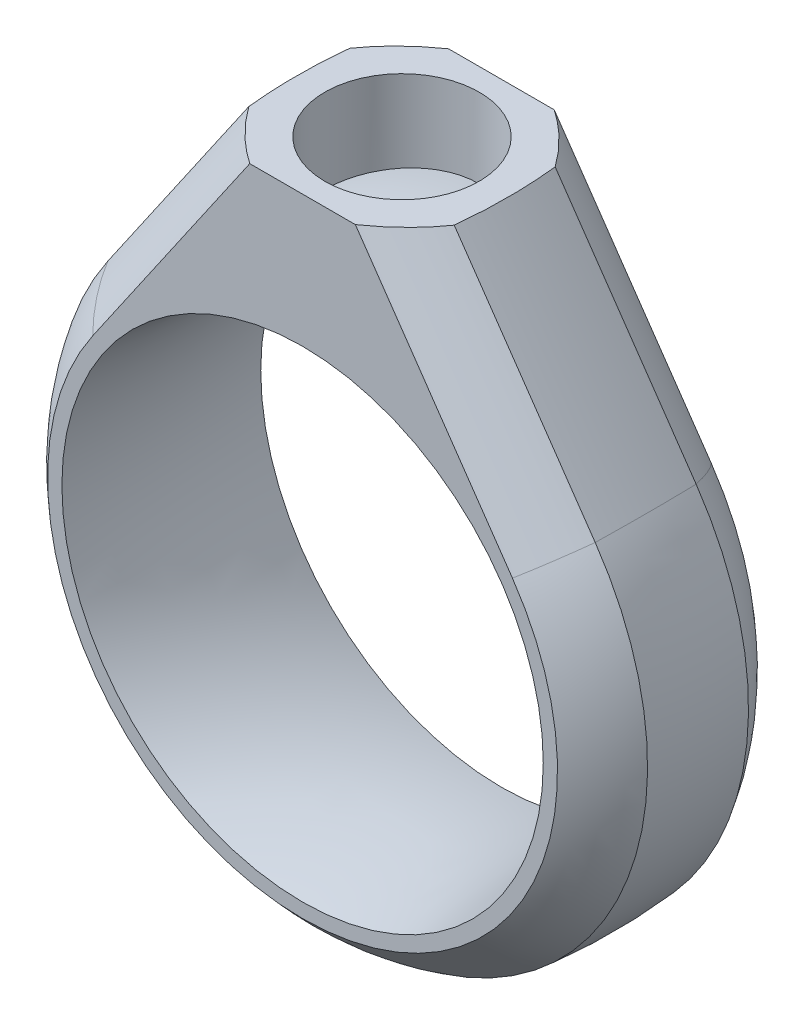
ISO-10303-21;
HEADER;
FILE_DESCRIPTION(('STEP AP214'),'2;1');
FILE_NAME('part.step','',(''),(''),'','','');
FILE_SCHEMA(('AUTOMOTIVE_DESIGN { 1 0 10303 214 1 1 1 1 }'));
ENDSEC;
DATA;
#1=APPLICATION_CONTEXT('core data for automotive mechanical design processes');
#2=APPLICATION_PROTOCOL_DEFINITION('international standard','automotive_design',2000,#1);
#3=PRODUCT_CONTEXT('',#1,'mechanical');
#4=PRODUCT('Part','Part','',(#3));
#5=PRODUCT_RELATED_PRODUCT_CATEGORY('part','',(#4));
#6=PRODUCT_DEFINITION_FORMATION('','',#4);
#7=PRODUCT_DEFINITION_CONTEXT('part definition',#1,'design');
#8=PRODUCT_DEFINITION('design','',#6,#7);
#9=PRODUCT_DEFINITION_SHAPE('','',#8);
#10=(LENGTH_UNIT() NAMED_UNIT(*) SI_UNIT(.MILLI.,.METRE.));
#11=(NAMED_UNIT(*) PLANE_ANGLE_UNIT() SI_UNIT($,.RADIAN.));
#12=(NAMED_UNIT(*) SI_UNIT($,.STERADIAN.) SOLID_ANGLE_UNIT());
#13=UNCERTAINTY_MEASURE_WITH_UNIT(LENGTH_MEASURE(1.E-05),#10,'distance_accuracy_value','');
#14=(GEOMETRIC_REPRESENTATION_CONTEXT(3) GLOBAL_UNCERTAINTY_ASSIGNED_CONTEXT((#13)) GLOBAL_UNIT_ASSIGNED_CONTEXT((#10,
#11,#12)) REPRESENTATION_CONTEXT('',''));
#15=CARTESIAN_POINT('',(0.,0.,0.));
#16=DIRECTION('',(0.,0.,1.));
#17=DIRECTION('',(1.,0.,0.));
#18=AXIS2_PLACEMENT_3D('',#15,#16,#17);
#19=CARTESIAN_POINT('',(0.,-11.43,1.59200093369737));
#20=DIRECTION('',(0.,0.,1.));
#21=DIRECTION('',(1.,0.,0.));
#22=AXIS2_PLACEMENT_3D('',#19,#20,#21);
#23=DEGENERATE_TOROIDAL_SURFACE('',#22,5.23755739491984,7.05181139582833,.T.);
#24=CARTESIAN_POINT('',(4.31107537380725,-8.4556703971429,1.59200093369736));
#25=DIRECTION('',(0.567884870482195,-0.823107996484921,0.));
#26=DIRECTION('',(0.823107996484921,0.567884870482195,0.));
#27=AXIS2_PLACEMENT_3D('',#24,#25,#26);
#28=CIRCLE('',#27,7.05181139582833);
#29=CARTESIAN_POINT('',(8.04207328577188,-5.88155220724121,-3.81));
#30=VERTEX_POINT('',#29);
#31=CARTESIAN_POINT('',(9.33783526235542,-4.98757034168976,-1.93390476421679));
#32=VERTEX_POINT('',#31);
#33=EDGE_CURVE('E386',#30,#32,#28,.T.);
#34=ORIENTED_EDGE('',*,*,#33,.T.);
#35=CARTESIAN_POINT('',(0.,-11.43,-1.93390476421679));
#36=DIRECTION('',(0.,0.,1.));
#37=DIRECTION('',(1.,0.,0.));
#38=AXIS2_PLACEMENT_3D('',#35,#36,#37);
#39=CIRCLE('',#38,11.3446052064038);
#40=CARTESIAN_POINT('',(-9.33783526235542,-4.98757034168976,-1.93390476421679));
#41=VERTEX_POINT('',#40);
#42=EDGE_CURVE('E53',#41,#32,#39,.T.);
#43=ORIENTED_EDGE('',*,*,#42,.F.);
#44=CARTESIAN_POINT('',(-4.3110753738073,-8.45567039714285,1.59200093369733));
#45=DIRECTION('',(0.567884870482195,0.823107996484921,0.));
#46=DIRECTION('',(-0.823107996484921,0.567884870482195,0.));
#47=AXIS2_PLACEMENT_3D('',#44,#45,#46);
#48=CIRCLE('',#47,7.05181139582826);
#49=CARTESIAN_POINT('',(-8.04207328577188,-5.88155220724121,-3.81));
#50=VERTEX_POINT('',#49);
#51=EDGE_CURVE('E385',#50,#41,#48,.T.);
#52=ORIENTED_EDGE('',*,*,#51,.F.);
#53=CARTESIAN_POINT('',(0.,-11.43,-3.81));
#54=DIRECTION('',(0.,0.,1.));
#55=DIRECTION('',(1.,0.,0.));
#56=AXIS2_PLACEMENT_3D('',#53,#54,#55);
#57=CIRCLE('',#56,9.77037438600464);
#58=EDGE_CURVE('E153',#30,#50,#57,.F.);
#59=ORIENTED_EDGE('',*,*,#58,.F.);
#60=EDGE_LOOP('',(#34,#43,#52,#59));
#61=FACE_BOUND('',#60,.T.);
#62=ADVANCED_FACE('F45',(#61),#23,.T.);
#63=CARTESIAN_POINT('',(0.,-11.43,-1.59200093369734));
#64=DIRECTION('',(0.,0.,1.));
#65=DIRECTION('',(1.,0.,0.));
#66=AXIS2_PLACEMENT_3D('',#63,#64,#65);
#67=DEGENERATE_TOROIDAL_SURFACE('',#66,5.23755739491988,7.05181139582828,.T.);
#68=CARTESIAN_POINT('',(4.31107537380724,-8.4556703971429,-1.59200093369738));
#69=DIRECTION('',(0.567884870482195,-0.823107996484921,0.));
#70=DIRECTION('',(0.823107996484921,0.567884870482195,0.));
#71=AXIS2_PLACEMENT_3D('',#68,#69,#70);
#72=CIRCLE('',#71,7.05181139582834);
#73=CARTESIAN_POINT('',(9.33783526235542,-4.98757034168976,1.93390476421677));
#74=VERTEX_POINT('',#73);
#75=CARTESIAN_POINT('',(8.04207328577187,-5.88155220724121,3.81));
#76=VERTEX_POINT('',#75);
#77=EDGE_CURVE('E111',#74,#76,#72,.T.);
#78=ORIENTED_EDGE('',*,*,#77,.T.);
#79=CARTESIAN_POINT('',(0.,-11.43,3.81));
#80=DIRECTION('',(0.,0.,1.));
#81=DIRECTION('',(1.,0.,0.));
#82=AXIS2_PLACEMENT_3D('',#79,#80,#81);
#83=CIRCLE('',#82,9.77037438600463);
#84=CARTESIAN_POINT('',(-8.04207328577187,-5.8815522072412,3.81000000000001));
#85=VERTEX_POINT('',#84);
#86=EDGE_CURVE('E396',#85,#76,#83,.T.);
#87=ORIENTED_EDGE('',*,*,#86,.F.);
#88=CARTESIAN_POINT('',(-4.31107537380721,-8.45567039714292,-1.59200093369738));
#89=DIRECTION('',(0.567884870482195,0.823107996484921,0.));
#90=DIRECTION('',(-0.823107996484921,0.567884870482195,0.));
#91=AXIS2_PLACEMENT_3D('',#88,#89,#90);
#92=CIRCLE('',#91,7.05181139582838);
#93=CARTESIAN_POINT('',(-9.33783526235542,-4.98757034168975,1.93390476421677));
#94=VERTEX_POINT('',#93);
#95=EDGE_CURVE('E142',#94,#85,#92,.T.);
#96=ORIENTED_EDGE('',*,*,#95,.F.);
#97=CARTESIAN_POINT('',(0.,-11.43,1.93390476421677));
#98=DIRECTION('',(0.,0.,-1.));
#99=DIRECTION('',(-1.,0.,0.));
#100=AXIS2_PLACEMENT_3D('',#97,#98,#99);
#101=CIRCLE('',#100,11.3446052064038);
#102=EDGE_CURVE('E132',#74,#94,#101,.T.);
#103=ORIENTED_EDGE('',*,*,#102,.F.);
#104=EDGE_LOOP('',(#78,#87,#96,#103));
#105=FACE_BOUND('',#104,.T.);
#106=ADVANCED_FACE('F141',(#105),#67,.T.);
#107=CARTESIAN_POINT('',(0.,-11.43,0.));
#108=DIRECTION('',(0.,0.,1.));
#109=DIRECTION('',(1.,0.,0.));
#110=AXIS2_PLACEMENT_3D('',#107,#108,#109);
#111=DEGENERATE_TOROIDAL_SURFACE('',#110,10.5109155407772,21.9409155407772,.F.);
#112=CARTESIAN_POINT('',(8.65161863199134,-17.3989899105235,0.));
#113=DIRECTION('',(0.567884870482195,0.823107996484921,0.));
#114=DIRECTION('',(-0.823107996484921,0.567884870482195,0.));
#115=AXIS2_PLACEMENT_3D('',#112,#113,#114);
#116=CIRCLE('',#115,21.9409155407772);
#117=EDGE_CURVE('E171',#94,#41,#116,.F.);
#118=ORIENTED_EDGE('',*,*,#117,.T.);
#119=ORIENTED_EDGE('',*,*,#42,.T.);
#120=CARTESIAN_POINT('',(-8.65161863199133,-17.3989899105236,0.));
#121=DIRECTION('',(0.567884870482195,-0.823107996484921,0.));
#122=DIRECTION('',(0.823107996484921,0.567884870482195,0.));
#123=AXIS2_PLACEMENT_3D('',#120,#121,#122);
#124=CIRCLE('',#123,21.9409155407772);
#125=EDGE_CURVE('E129',#32,#74,#124,.T.);
#126=ORIENTED_EDGE('',*,*,#125,.T.);
#127=ORIENTED_EDGE('',*,*,#102,.T.);
#128=EDGE_LOOP('',(#118,#119,#126,#127));
#129=FACE_BOUND('',#128,.T.);
#130=ADVANCED_FACE('F131',(#129),#111,.F.);
#131=CARTESIAN_POINT('',(0.,-11.43,-3.81));
#132=DIRECTION('',(0.,0.,1.));
#133=DIRECTION('',(1.,0.,0.));
#134=AXIS2_PLACEMENT_3D('',#131,#132,#133);
#135=PLANE('',#134);
#136=ORIENTED_EDGE('',*,*,#58,.T.);
#137=DIRECTION('',(0.567884870482194,0.823107996484921,0.));
#138=VECTOR('',#137,1.);
#139=CARTESIAN_POINT('',(-2.54332447316267,2.0884860057464,-3.81));
#140=LINE('',#139,#138);
#141=CARTESIAN_POINT('',(-2.023683344541,2.84166819196623,-3.81));
#142=VERTEX_POINT('',#141);
#143=EDGE_CURVE('E156',#50,#142,#140,.T.);
#144=ORIENTED_EDGE('',*,*,#143,.T.);
#145=DIRECTION('',(-1.,0.,0.));
#146=VECTOR('',#145,1.);
#147=CARTESIAN_POINT('',(0.,2.84166819196623,-3.81));
#148=LINE('',#147,#146);
#149=CARTESIAN_POINT('',(2.02368334454099,2.84166819196623,-3.81));
#150=VERTEX_POINT('',#149);
#151=EDGE_CURVE('E161',#150,#142,#148,.T.);
#152=ORIENTED_EDGE('',*,*,#151,.F.);
#153=DIRECTION('',(0.567884870482195,-0.823107996484921,0.));
#154=VECTOR('',#153,1.);
#155=CARTESIAN_POINT('',(8.04207328577187,-5.8815522072412,-3.81));
#156=LINE('',#155,#154);
#157=EDGE_CURVE('E150',#150,#30,#156,.T.);
#158=ORIENTED_EDGE('',*,*,#157,.T.);
#159=EDGE_LOOP('',(#136,#144,#152,#158));
#160=FACE_BOUND('',#159,.T.);
#161=CARTESIAN_POINT('',(0.,-11.43,-3.81000000000001));
#162=DIRECTION('',(0.,0.,-1.));
#163=DIRECTION('',(-1.,0.,0.));
#164=AXIS2_PLACEMENT_3D('',#161,#162,#163);
#165=CIRCLE('',#164,9.22333180803377);
#166=CARTESIAN_POINT('',(-9.22333180803377,-11.43,-3.81000000000001));
#167=VERTEX_POINT('',#166);
#168=EDGE_CURVE('E177',#167,#167,#165,.T.);
#169=ORIENTED_EDGE('',*,*,#168,.F.);
#170=EDGE_LOOP('',(#169));
#171=FACE_BOUND('',#170,.T.);
#172=ADVANCED_FACE('F47',(#160,#171),#135,.F.);
#173=CARTESIAN_POINT('',(0.,-11.43,3.81));
#174=DIRECTION('',(0.,0.,1.));
#175=DIRECTION('',(1.,0.,0.));
#176=AXIS2_PLACEMENT_3D('',#173,#174,#175);
#177=PLANE('',#176);
#178=ORIENTED_EDGE('',*,*,#86,.T.);
#179=DIRECTION('',(-0.567884870482195,0.823107996484921,0.));
#180=VECTOR('',#179,1.);
#181=CARTESIAN_POINT('',(2.54332447316265,2.08848600574639,3.81));
#182=LINE('',#181,#180);
#183=CARTESIAN_POINT('',(2.02368334454097,2.84166819196623,3.81));
#184=VERTEX_POINT('',#183);
#185=EDGE_CURVE('E118',#76,#184,#182,.T.);
#186=ORIENTED_EDGE('',*,*,#185,.T.);
#187=DIRECTION('',(1.,0.,0.));
#188=VECTOR('',#187,1.);
#189=CARTESIAN_POINT('',(-3.81,2.84166819196623,3.81));
#190=LINE('',#189,#188);
#191=CARTESIAN_POINT('',(-2.02368334454099,2.84166819196623,3.81));
#192=VERTEX_POINT('',#191);
#193=EDGE_CURVE('E172',#184,#192,#190,.F.);
#194=ORIENTED_EDGE('',*,*,#193,.T.);
#195=DIRECTION('',(-0.567884870482195,-0.823107996484921,0.));
#196=VECTOR('',#195,1.);
#197=CARTESIAN_POINT('',(-8.04207328577187,-5.8815522072412,3.81));
#198=LINE('',#197,#196);
#199=EDGE_CURVE('E174',#192,#85,#198,.T.);
#200=ORIENTED_EDGE('',*,*,#199,.T.);
#201=EDGE_LOOP('',(#178,#186,#194,#200));
#202=FACE_BOUND('',#201,.T.);
#203=CARTESIAN_POINT('',(0.,-11.43,3.81000000000001));
#204=DIRECTION('',(0.,0.,1.));
#205=DIRECTION('',(1.,0.,0.));
#206=AXIS2_PLACEMENT_3D('',#203,#204,#205);
#207=CIRCLE('',#206,9.22333180803377);
#208=CARTESIAN_POINT('',(9.22333180803377,-11.43,3.81000000000001));
#209=VERTEX_POINT('',#208);
#210=EDGE_CURVE('E191',#209,#209,#207,.T.);
#211=ORIENTED_EDGE('',*,*,#210,.F.);
#212=EDGE_LOOP('',(#211));
#213=FACE_BOUND('',#212,.T.);
#214=ADVANCED_FACE('F207',(#202,#213),#177,.T.);
#215=CARTESIAN_POINT('',(0.,2.84166819196623,0.));
#216=DIRECTION('',(0.,1.,0.));
#217=DIRECTION('',(0.,0.,1.));
#218=AXIS2_PLACEMENT_3D('',#215,#216,#217);
#219=PLANE('',#218);
#220=ORIENTED_EDGE('',*,*,#151,.T.);
#221=CARTESIAN_POINT('',(3.48326958319402,2.84166819196623,1.59200093369732));
#222=DIRECTION('',(0.,1.,0.));
#223=DIRECTION('',(-1.,0.,0.));
#224=AXIS2_PLACEMENT_3D('',#221,#222,#223);
#225=ELLIPSE('',#224,8.56729788307609,7.05181139582826);
#226=CARTESIAN_POINT('',(-3.93622802533852,2.84166819196623,-1.9339047642168));
#227=VERTEX_POINT('',#226);
#228=EDGE_CURVE('E169',#142,#227,#225,.T.);
#229=ORIENTED_EDGE('',*,*,#228,.T.);
#230=CARTESIAN_POINT('',(22.616205969368,2.84166819196623,0.));
#231=DIRECTION('',(0.,1.,0.));
#232=DIRECTION('',(-1.,0.,0.));
#233=AXIS2_PLACEMENT_3D('',#230,#231,#232);
#234=ELLIPSE('',#233,26.6561807617905,21.9409155407773);
#235=CARTESIAN_POINT('',(-3.93622802533853,2.84166819196623,1.93390476421676));
#236=VERTEX_POINT('',#235);
#237=EDGE_CURVE('E136',#227,#236,#234,.T.);
#238=ORIENTED_EDGE('',*,*,#237,.T.);
#239=CARTESIAN_POINT('',(3.48326958319416,2.84166819196623,-1.59200093369739));
#240=DIRECTION('',(0.,1.,0.));
#241=DIRECTION('',(-1.,0.,0.));
#242=AXIS2_PLACEMENT_3D('',#239,#240,#241);
#243=ELLIPSE('',#242,8.56729788307623,7.05181139582838);
#244=EDGE_CURVE('E388',#236,#192,#243,.T.);
#245=ORIENTED_EDGE('',*,*,#244,.T.);
#246=ORIENTED_EDGE('',*,*,#193,.F.);
#247=CARTESIAN_POINT('',(-3.48326958319413,2.84166819196623,-1.59200093369738));
#248=DIRECTION('',(0.,1.,0.));
#249=DIRECTION('',(1.,0.,0.));
#250=AXIS2_PLACEMENT_3D('',#247,#248,#249);
#251=ELLIPSE('',#250,8.56729788307619,7.05181139582834);
#252=CARTESIAN_POINT('',(3.93622802533851,2.84166819196623,1.93390476421678));
#253=VERTEX_POINT('',#252);
#254=EDGE_CURVE('E123',#253,#184,#251,.F.);
#255=ORIENTED_EDGE('',*,*,#254,.F.);
#256=CARTESIAN_POINT('',(-22.616205969368,2.84166819196623,0.));
#257=DIRECTION('',(0.,1.,0.));
#258=DIRECTION('',(1.,0.,0.));
#259=AXIS2_PLACEMENT_3D('',#256,#257,#258);
#260=ELLIPSE('',#259,26.6561807617904,21.9409155407772);
#261=CARTESIAN_POINT('',(3.93622802533851,2.84166819196623,-1.93390476421679));
#262=VERTEX_POINT('',#261);
#263=EDGE_CURVE('E137',#262,#253,#260,.F.);
#264=ORIENTED_EDGE('',*,*,#263,.F.);
#265=CARTESIAN_POINT('',(-3.48326958319411,2.84166819196623,1.59200093369736));
#266=DIRECTION('',(0.,1.,0.));
#267=DIRECTION('',(1.,0.,0.));
#268=AXIS2_PLACEMENT_3D('',#265,#266,#267);
#269=ELLIPSE('',#268,8.56729788307617,7.05181139582833);
#270=EDGE_CURVE('E60',#150,#262,#269,.F.);
#271=ORIENTED_EDGE('',*,*,#270,.F.);
#272=EDGE_LOOP('',(#220,#229,#238,#245,#246,#255,#264,#271));
#273=FACE_BOUND('',#272,.T.);
#274=CARTESIAN_POINT('',(0.,2.84166819196623,0.));
#275=DIRECTION('',(0.,1.,0.));
#276=DIRECTION('',(0.,0.,1.));
#277=AXIS2_PLACEMENT_3D('',#274,#275,#276);
#278=CIRCLE('',#277,2.9591);
#279=CARTESIAN_POINT('',(0.,2.84166819196623,2.9591));
#280=VERTEX_POINT('',#279);
#281=EDGE_CURVE('E181',#280,#280,#278,.F.);
#282=ORIENTED_EDGE('',*,*,#281,.T.);
#283=EDGE_LOOP('',(#282));
#284=FACE_BOUND('',#283,.T.);
#285=ADVANCED_FACE('F166',(#273,#284),#219,.T.);
#286=CARTESIAN_POINT('',(0.,-1.27,0.));
#287=DIRECTION('',(0.,1.,0.));
#288=DIRECTION('',(0.,0.,1.));
#289=AXIS2_PLACEMENT_3D('',#286,#287,#288);
#290=CYLINDRICAL_SURFACE('',#289,2.9591);
#291=CARTESIAN_POINT('',(-2.10934564289651,-0.296423624207437,-2.0753153420135));
#292=CARTESIAN_POINT('',(-1.99288861060094,-0.28580718478686,-2.19367269173789));
#293=CARTESIAN_POINT('',(-1.86637758360398,-0.275162572565729,-2.30227929768123));
#294=CARTESIAN_POINT('',(-1.59677930277951,-0.255011402896367,-2.49684934189497));
#295=CARTESIAN_POINT('',(-1.45367525826803,-0.24550601837311,-2.58278955074604));
#296=CARTESIAN_POINT('',(-1.15497002760406,-0.228708759502768,-2.72946618635744));
#297=CARTESIAN_POINT('',(-0.999370556486257,-0.221416582040807,-2.79020606490567));
#298=CARTESIAN_POINT('',(-0.680112300774695,-0.209868217022376,-2.88468852205632));
#299=CARTESIAN_POINT('',(-0.516455567594511,-0.205611260915275,-2.91843793519779));
#300=CARTESIAN_POINT('',(-0.186587350480859,-0.200624673832578,-2.95785533714019));
#301=CARTESIAN_POINT('',(-0.0203931226636631,-0.199877188827538,-2.96366546748741));
#302=CARTESIAN_POINT('',(0.310607045654622,-0.201944995038328,-2.94741456232979));
#303=CARTESIAN_POINT('',(0.475412966505218,-0.20476033659841,-2.92535313298801));
#304=CARTESIAN_POINT('',(0.798349893352749,-0.213621672486935,-2.85414682402168));
#305=CARTESIAN_POINT('',(0.956502655896553,-0.219656081220961,-2.80509904993331));
#306=CARTESIAN_POINT('',(1.26233644108024,-0.234278601388692,-2.68141571828597));
#307=CARTESIAN_POINT('',(1.41001712694507,-0.242866794904336,-2.60677933826438));
#308=CARTESIAN_POINT('',(1.69156737064951,-0.261698751125254,-2.43358429864705));
#309=CARTESIAN_POINT('',(1.82536050940857,-0.271950952571185,-2.33490234496455));
#310=CARTESIAN_POINT('',(2.07455442384477,-0.292939657793367,-2.11658670405717));
#311=CARTESIAN_POINT('',(2.1899544629323,-0.303676180943199,-1.99695217814579));
#312=CARTESIAN_POINT('',(2.39979307668759,-0.324500773611889,-1.73926378581076));
#313=CARTESIAN_POINT('',(2.49410150372073,-0.334584558086302,-1.60110353962273));
#314=CARTESIAN_POINT('',(2.65817536023991,-0.352888163767065,-1.31079178081007));
#315=CARTESIAN_POINT('',(2.72794122333106,-0.361108017903445,-1.15864051543134));
#316=CARTESIAN_POINT('',(2.84074907747629,-0.37472387672785,-0.845051018201356));
#317=CARTESIAN_POINT('',(2.883858981373,-0.380127052058684,-0.683637541687277));
#318=CARTESIAN_POINT('',(2.94234771409007,-0.387517794715346,-0.355788637531928));
#319=CARTESIAN_POINT('',(2.95772795166279,-0.389505535555509,-0.189353465445036));
#320=CARTESIAN_POINT('',(2.96028693398357,-0.389834184231341,0.142529577451922));
#321=CARTESIAN_POINT('',(2.94766864628814,-0.388201338565869,0.30797589275243));
#322=CARTESIAN_POINT('',(2.89502468763739,-0.381529955261976,0.63437533991298));
#323=CARTESIAN_POINT('',(2.85499907479067,-0.376491424844236,0.795328481298627));
#324=CARTESIAN_POINT('',(2.74875017452136,-0.363585769666008,1.10811198207274));
#325=CARTESIAN_POINT('',(2.68254185249992,-0.355720260971369,1.2599474958712));
#326=CARTESIAN_POINT('',(2.52582611201067,-0.338044745581464,1.55038956336692));
#327=CARTESIAN_POINT('',(2.43531757499899,-0.328234649381878,1.6889955077062));
#328=CARTESIAN_POINT('',(2.23182401605386,-0.30768993188463,1.95008156211196));
#329=CARTESIAN_POINT('',(2.11868672388715,-0.296949343003101,2.07244253630309));
#330=CARTESIAN_POINT('',(1.87349060968842,-0.275805283219948,2.2964945629626));
#331=CARTESIAN_POINT('',(1.74143130991772,-0.265401820838153,2.39818509339135));
#332=CARTESIAN_POINT('',(1.46153973382381,-0.246058537586309,2.57836673382266));
#333=CARTESIAN_POINT('',(1.31365132236626,-0.237124231213057,2.65677128861118));
#334=CARTESIAN_POINT('',(1.00667509980564,-0.221774329133808,2.78759979855516));
#335=CARTESIAN_POINT('',(0.847587708391712,-0.215358639100203,2.84002472672291));
#336=CARTESIAN_POINT('',(0.523616088379425,-0.205798440564579,2.9171353510686));
#337=CARTESIAN_POINT('',(0.358766771818302,-0.202636894960779,2.94196557466951));
#338=CARTESIAN_POINT('',(0.0272120608337168,-0.199882296848929,2.96363444403453));
#339=CARTESIAN_POINT('',(-0.139493259784035,-0.200289102944707,2.96047419892277));
#340=CARTESIAN_POINT('',(-0.468980642716454,-0.204611733950232,2.92636295694944));
#341=CARTESIAN_POINT('',(-0.631780138690423,-0.208506680180955,2.89557731301894));
#342=CARTESIAN_POINT('',(-0.949881414613708,-0.219342521353727,2.80735508802294));
#343=CARTESIAN_POINT('',(-1.10518307243371,-0.226283465892265,2.74991807300543));
#344=CARTESIAN_POINT('',(-1.40434060509113,-0.242463060100374,2.60987505125342));
#345=CARTESIAN_POINT('',(-1.54816625812122,-0.251707528445063,2.52720518582754));
#346=CARTESIAN_POINT('',(-1.81996267994666,-0.271461479284674,2.33908690331276));
#347=CARTESIAN_POINT('',(-1.94793266074305,-0.281971024600557,2.23363735482773));
#348=CARTESIAN_POINT('',(-2.18534413872707,-0.30316844776793,2.0020580434577));
#349=CARTESIAN_POINT('',(-2.29464695350946,-0.313857062953686,1.87578612662817));
#350=CARTESIAN_POINT('',(-2.49053205393408,-0.334135742740321,1.6066200970514));
#351=CARTESIAN_POINT('',(-2.57711418985848,-0.343725800102022,1.4637258747805));
#352=CARTESIAN_POINT('',(-2.72513324744607,-0.360724931099939,1.16520230331296));
#353=CARTESIAN_POINT('',(-2.78655190082465,-0.368132419134065,1.0095637999789));
#354=CARTESIAN_POINT('',(-2.88233970534552,-0.379904662082113,0.690071219120064));
#355=CARTESIAN_POINT('',(-2.91671107508839,-0.384269666557696,0.526217816609757));
#356=CARTESIAN_POINT('',(-2.95723533175302,-0.389433262841511,0.196171405027991));
#357=CARTESIAN_POINT('',(-2.9635843044214,-0.3902566360545,0.030002842218513));
#358=CARTESIAN_POINT('',(-2.94840471814257,-0.388309789755523,-0.301069321781287));
#359=CARTESIAN_POINT('',(-2.92687103318563,-0.385538909467841,-0.465972684767479));
#360=CARTESIAN_POINT('',(-2.85669117075008,-0.376736888812864,-0.789216422199821));
#361=CARTESIAN_POINT('',(-2.8081357895065,-0.370716668659815,-0.947576877489615));
#362=CARTESIAN_POINT('',(-2.68541424215469,-0.35610747132071,-1.25378619120863));
#363=CARTESIAN_POINT('',(-2.61127299552926,-0.347520994639093,-1.40164510932486));
#364=CARTESIAN_POINT('',(-2.46654960642954,-0.331697765132313,-1.63865980471557));
#365=CARTESIAN_POINT('',(-2.40214760911404,-0.324882632589833,-1.7316798528157));
#366=CARTESIAN_POINT('',(-2.26316378084488,-0.310857224348801,-1.90974306614391));
#367=CARTESIAN_POINT('',(-2.18858186374216,-0.303646945306574,-1.99478616385562));
#368=CARTESIAN_POINT('',(-2.10934564289651,-0.296423624207437,-2.0753153420135));
#369=B_SPLINE_CURVE_WITH_KNOTS('',3,(#291,#292,#293,#294,#295,#296,#297,#298,#299,#300,#301,
#302,#303,#304,#305,#306,#307,#308,#309,#310,#311,#312,#313,#314,#315,#316,#317,#318,#319,#320,
#321,#322,#323,#324,#325,#326,#327,#328,#329,#330,#331,#332,#333,#334,#335,#336,#337,#338,#339,
#340,#341,#342,#343,#344,#345,#346,#347,#348,#349,#350,#351,#352,#353,#354,#355,#356,#357,#358,
#359,#360,#361,#362,#363,#364,#365,#366,#367,#368),.UNSPECIFIED.,.T.,.F.,(4,2,2,2,2,2,2,2,2,2,2,
2,2,2,2,2,2,2,2,2,2,2,2,2,2,2,2,2,2,2,2,2,2,2,2,2,2,2,4),(0.,0.498741395302189,
0.997991951673904,1.49717410114765,1.99622980741067,2.49274385415429,2.98926491693038,
3.48401091248615,3.97877281153619,4.47612706361504,4.97350122826916,5.47386463329637,
5.97421919772206,6.47329367145189,6.97234278994876,7.46778601763824,7.96322819489979,
8.45838759778722,8.953569796872,9.45220355872269,9.95084991218748,10.4513272073827,
10.9517857568362,11.4496106143531,11.9474157456162,12.4422609742405,12.9371142604848,
13.4332304420517,13.9293712698368,14.4290512568332,14.9287345363863,15.4287799379102,
15.9287843180618,16.425284330994,16.9218756345528,17.4168083178953,17.9112603131873,
18.2505961876816,18.5899349340335),.UNSPECIFIED.);
#370=CARTESIAN_POINT('',(-2.10934564289651,-0.296423624207437,-2.0753153420135));
#371=VERTEX_POINT('',#370);
#372=EDGE_CURVE('E184',#371,#371,#369,.T.);
#373=ORIENTED_EDGE('',*,*,#372,.T.);
#374=EDGE_LOOP('',(#373));
#375=FACE_BOUND('',#374,.T.);
#376=ORIENTED_EDGE('',*,*,#281,.F.);
#377=EDGE_LOOP('',(#376));
#378=FACE_BOUND('',#377,.T.);
#379=ADVANCED_FACE('F193',(#375,#378),#290,.F.);
#380=ORIENTED_EDGE('',*,*,#372,.F.);
#381=EDGE_LOOP('',(#380));
#382=FACE_BOUND('',#381,.T.);
#383=ADVANCED_FACE('F200',(#382),#111,.F.);
#384=CARTESIAN_POINT('',(0.,-11.43,0.));
#385=DIRECTION('',(0.,0.,1.));
#386=DIRECTION('',(1.,0.,0.));
#387=AXIS2_PLACEMENT_3D('',#384,#385,#386);
#388=TOROIDAL_SURFACE('',#387,30.8309155407772,21.9409155407772);
#389=ORIENTED_EDGE('',*,*,#210,.T.);
#390=EDGE_LOOP('',(#389));
#391=FACE_BOUND('',#390,.T.);
#392=ORIENTED_EDGE('',*,*,#168,.T.);
#393=EDGE_LOOP('',(#392));
#394=FACE_BOUND('',#393,.T.);
#395=ADVANCED_FACE('F203',(#391,#394),#388,.T.);
#396=CARTESIAN_POINT('',(8.65161863199138,-17.3989899105236,0.));
#397=DIRECTION('',(0.567884870482195,0.823107996484921,0.));
#398=DIRECTION('',(-0.823107996484921,0.567884870482195,0.));
#399=AXIS2_PLACEMENT_3D('',#396,#397,#398);
#400=CYLINDRICAL_SURFACE('',#399,21.9409155407773);
#401=ORIENTED_EDGE('',*,*,#237,.F.);
#402=DIRECTION('',(0.567884870482195,0.823107996484921,0.));
#403=VECTOR('',#402,1.);
#404=CARTESIAN_POINT('',(-9.33783526235542,-4.98757034168976,-1.93390476421679));
#405=LINE('',#404,#403);
#406=EDGE_CURVE('E144',#227,#41,#405,.F.);
#407=ORIENTED_EDGE('',*,*,#406,.T.);
#408=ORIENTED_EDGE('',*,*,#117,.F.);
#409=DIRECTION('',(0.567884870482195,0.823107996484921,0.));
#410=VECTOR('',#409,1.);
#411=CARTESIAN_POINT('',(-9.33783526235543,-4.98757034168976,1.93390476421677));
#412=LINE('',#411,#410);
#413=EDGE_CURVE('E68',#94,#236,#412,.T.);
#414=ORIENTED_EDGE('',*,*,#413,.T.);
#415=EDGE_LOOP('',(#401,#407,#408,#414));
#416=FACE_BOUND('',#415,.T.);
#417=ADVANCED_FACE('F201',(#416),#400,.T.);
#418=CARTESIAN_POINT('',(-8.65161863199133,-17.3989899105236,0.));
#419=DIRECTION('',(-0.567884870482195,0.823107996484921,0.));
#420=DIRECTION('',(-0.823107996484921,-0.567884870482195,0.));
#421=AXIS2_PLACEMENT_3D('',#418,#419,#420);
#422=CYLINDRICAL_SURFACE('',#421,21.9409155407772);
#423=ORIENTED_EDGE('',*,*,#125,.F.);
#424=DIRECTION('',(-0.567884870482195,0.823107996484921,0.));
#425=VECTOR('',#424,1.);
#426=CARTESIAN_POINT('',(9.33783526235542,-4.98757034168976,-1.93390476421679));
#427=LINE('',#426,#425);
#428=EDGE_CURVE('E12',#32,#262,#427,.T.);
#429=ORIENTED_EDGE('',*,*,#428,.T.);
#430=ORIENTED_EDGE('',*,*,#263,.T.);
#431=DIRECTION('',(-0.567884870482195,0.823107996484921,0.));
#432=VECTOR('',#431,1.);
#433=CARTESIAN_POINT('',(9.33783526235542,-4.98757034168976,1.93390476421677));
#434=LINE('',#433,#432);
#435=EDGE_CURVE('E115',#253,#74,#434,.F.);
#436=ORIENTED_EDGE('',*,*,#435,.T.);
#437=EDGE_LOOP('',(#423,#429,#430,#436));
#438=FACE_BOUND('',#437,.T.);
#439=ADVANCED_FACE('F139',(#438),#422,.T.);
#440=CARTESIAN_POINT('',(-4.31107537380721,-8.45567039714292,-1.59200093369738));
#441=DIRECTION('',(0.567884870482195,0.823107996484921,0.));
#442=DIRECTION('',(-0.823107996484921,0.567884870482195,0.));
#443=AXIS2_PLACEMENT_3D('',#440,#441,#442);
#444=CYLINDRICAL_SURFACE('',#443,7.05181139582838);
#445=ORIENTED_EDGE('',*,*,#199,.F.);
#446=ORIENTED_EDGE('',*,*,#244,.F.);
#447=ORIENTED_EDGE('',*,*,#413,.F.);
#448=ORIENTED_EDGE('',*,*,#95,.T.);
#449=EDGE_LOOP('',(#445,#446,#447,#448));
#450=FACE_BOUND('',#449,.T.);
#451=ADVANCED_FACE('F223',(#450),#444,.T.);
#452=CARTESIAN_POINT('',(-4.3110753738073,-8.45567039714285,1.59200093369733));
#453=DIRECTION('',(0.567884870482195,0.823107996484921,0.));
#454=DIRECTION('',(-0.823107996484921,0.567884870482195,0.));
#455=AXIS2_PLACEMENT_3D('',#452,#453,#454);
#456=CYLINDRICAL_SURFACE('',#455,7.05181139582826);
#457=ORIENTED_EDGE('',*,*,#406,.F.);
#458=ORIENTED_EDGE('',*,*,#228,.F.);
#459=ORIENTED_EDGE('',*,*,#143,.F.);
#460=ORIENTED_EDGE('',*,*,#51,.T.);
#461=EDGE_LOOP('',(#457,#458,#459,#460));
#462=FACE_BOUND('',#461,.T.);
#463=ADVANCED_FACE('F230',(#462),#456,.T.);
#464=CARTESIAN_POINT('',(4.31107537380725,-8.4556703971429,1.59200093369736));
#465=DIRECTION('',(-0.567884870482195,0.823107996484921,0.));
#466=DIRECTION('',(-0.823107996484921,-0.567884870482195,0.));
#467=AXIS2_PLACEMENT_3D('',#464,#465,#466);
#468=CYLINDRICAL_SURFACE('',#467,7.05181139582833);
#469=ORIENTED_EDGE('',*,*,#157,.F.);
#470=ORIENTED_EDGE('',*,*,#270,.T.);
#471=ORIENTED_EDGE('',*,*,#428,.F.);
#472=ORIENTED_EDGE('',*,*,#33,.F.);
#473=EDGE_LOOP('',(#469,#470,#471,#472));
#474=FACE_BOUND('',#473,.T.);
#475=ADVANCED_FACE('F271',(#474),#468,.T.);
#476=CARTESIAN_POINT('',(4.31107537380724,-8.4556703971429,-1.59200093369738));
#477=DIRECTION('',(-0.567884870482195,0.823107996484921,0.));
#478=DIRECTION('',(-0.823107996484921,-0.567884870482195,0.));
#479=AXIS2_PLACEMENT_3D('',#476,#477,#478);
#480=CYLINDRICAL_SURFACE('',#479,7.05181139582834);
#481=ORIENTED_EDGE('',*,*,#435,.F.);
#482=ORIENTED_EDGE('',*,*,#254,.T.);
#483=ORIENTED_EDGE('',*,*,#185,.F.);
#484=ORIENTED_EDGE('',*,*,#77,.F.);
#485=EDGE_LOOP('',(#481,#482,#483,#484));
#486=FACE_BOUND('',#485,.T.);
#487=ADVANCED_FACE('F113',(#486),#480,.T.);
#488=CLOSED_SHELL('',(#62,#106,#130,#172,#214,#285,#379,#383,#395,#417,#439,#451,#463,#475,#487));
#489=MANIFOLD_SOLID_BREP('B2',#488);
#490=ADVANCED_BREP_SHAPE_REPRESENTATION('',(#18,#489),#14);
#491=SHAPE_DEFINITION_REPRESENTATION(#9,#490);
ENDSEC;
END-ISO-10303-21;
